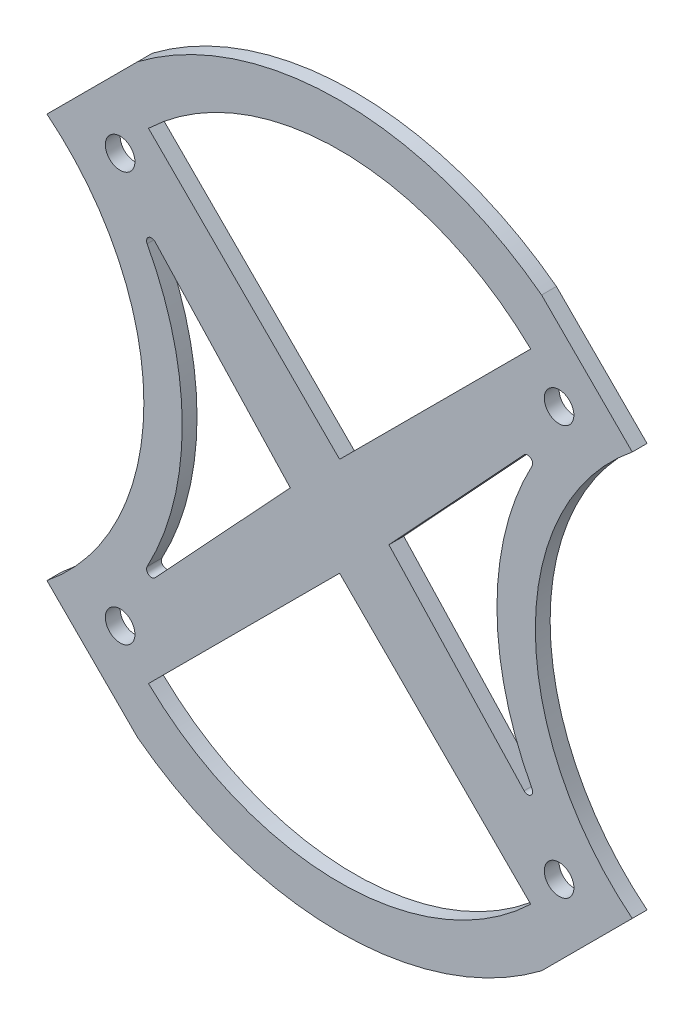
ISO-10303-21;
HEADER;
FILE_DESCRIPTION(('STEP AP214'),'2;1');
FILE_NAME('part.step','',(''),(''),'','','');
FILE_SCHEMA(('AUTOMOTIVE_DESIGN { 1 0 10303 214 1 1 1 1 }'));
ENDSEC;
DATA;
#1=APPLICATION_CONTEXT('core data for automotive mechanical design processes');
#2=APPLICATION_PROTOCOL_DEFINITION('international standard','automotive_design',2000,#1);
#3=PRODUCT_CONTEXT('',#1,'mechanical');
#4=PRODUCT('Part','Part','',(#3));
#5=PRODUCT_RELATED_PRODUCT_CATEGORY('part','',(#4));
#6=PRODUCT_DEFINITION_FORMATION('','',#4);
#7=PRODUCT_DEFINITION_CONTEXT('part definition',#1,'design');
#8=PRODUCT_DEFINITION('design','',#6,#7);
#9=PRODUCT_DEFINITION_SHAPE('','',#8);
#10=(LENGTH_UNIT() NAMED_UNIT(*) SI_UNIT(.MILLI.,.METRE.));
#11=(NAMED_UNIT(*) PLANE_ANGLE_UNIT() SI_UNIT($,.RADIAN.));
#12=(NAMED_UNIT(*) SI_UNIT($,.STERADIAN.) SOLID_ANGLE_UNIT());
#13=UNCERTAINTY_MEASURE_WITH_UNIT(LENGTH_MEASURE(1.E-05),#10,'distance_accuracy_value','');
#14=(GEOMETRIC_REPRESENTATION_CONTEXT(3) GLOBAL_UNCERTAINTY_ASSIGNED_CONTEXT((#13)) GLOBAL_UNIT_ASSIGNED_CONTEXT((#10,
#11,#12)) REPRESENTATION_CONTEXT('',''));
#15=CARTESIAN_POINT('',(0.,0.,0.));
#16=DIRECTION('',(0.,0.,1.));
#17=DIRECTION('',(1.,0.,0.));
#18=AXIS2_PLACEMENT_3D('',#15,#16,#17);
#19=CARTESIAN_POINT('',(-92.1866433585992,0.,3.));
#20=DIRECTION('',(0.,0.,-1.));
#21=DIRECTION('',(-1.,0.,0.));
#22=AXIS2_PLACEMENT_3D('',#19,#20,#21);
#23=PLANE('',#22);
#24=CARTESIAN_POINT('',(-44.5,41.5,3.));
#25=DIRECTION('',(0.,0.,1.));
#26=DIRECTION('',(1.,0.,0.));
#27=AXIS2_PLACEMENT_3D('',#24,#25,#26);
#28=CIRCLE('',#27,3.);
#29=CARTESIAN_POINT('',(-41.5,41.5,3.));
#30=VERTEX_POINT('',#29);
#31=EDGE_CURVE('E656',#30,#30,#28,.T.);
#32=ORIENTED_EDGE('',*,*,#31,.F.);
#33=EDGE_LOOP('',(#32));
#34=FACE_BOUND('',#33,.T.);
#35=CARTESIAN_POINT('',(44.5,41.5,3.));
#36=DIRECTION('',(0.,0.,1.));
#37=DIRECTION('',(1.,0.,0.));
#38=AXIS2_PLACEMENT_3D('',#35,#36,#37);
#39=CIRCLE('',#38,3.);
#40=CARTESIAN_POINT('',(47.5,41.5,3.));
#41=VERTEX_POINT('',#40);
#42=EDGE_CURVE('E660',#41,#41,#39,.T.);
#43=ORIENTED_EDGE('',*,*,#42,.F.);
#44=EDGE_LOOP('',(#43));
#45=FACE_BOUND('',#44,.T.);
#46=CARTESIAN_POINT('',(44.5,-41.5,3.));
#47=DIRECTION('',(0.,0.,1.));
#48=DIRECTION('',(1.,0.,0.));
#49=AXIS2_PLACEMENT_3D('',#46,#47,#48);
#50=CIRCLE('',#49,3.);
#51=CARTESIAN_POINT('',(47.5,-41.5,3.));
#52=VERTEX_POINT('',#51);
#53=EDGE_CURVE('E668',#52,#52,#50,.T.);
#54=ORIENTED_EDGE('',*,*,#53,.F.);
#55=EDGE_LOOP('',(#54));
#56=FACE_BOUND('',#55,.T.);
#57=CARTESIAN_POINT('',(-44.5,-41.5,3.));
#58=DIRECTION('',(0.,0.,1.));
#59=DIRECTION('',(1.,0.,0.));
#60=AXIS2_PLACEMENT_3D('',#57,#58,#59);
#61=CIRCLE('',#60,3.);
#62=CARTESIAN_POINT('',(-41.5,-41.5,3.));
#63=VERTEX_POINT('',#62);
#64=EDGE_CURVE('E666',#63,#63,#61,.T.);
#65=ORIENTED_EDGE('',*,*,#64,.F.);
#66=EDGE_LOOP('',(#65));
#67=FACE_BOUND('',#66,.T.);
#68=DIRECTION('',(0.680734224272991,0.732530488036812,0.));
#69=VECTOR('',#68,1.);
#70=CARTESIAN_POINT('',(-10.,0.,3.));
#71=LINE('',#70,#69);
#72=CARTESIAN_POINT('',(-37.4101351012741,-29.4957399333564,3.));
#73=VERTEX_POINT('',#72);
#74=CARTESIAN_POINT('',(-10.,0.,3.));
#75=VERTEX_POINT('',#74);
#76=EDGE_CURVE('E250',#73,#75,#71,.T.);
#77=ORIENTED_EDGE('',*,*,#76,.F.);
#78=CARTESIAN_POINT('',(-38.1426655893109,-28.8150057090834,3.));
#79=DIRECTION('',(0.,0.,1.));
#80=DIRECTION('',(-1.,0.,0.));
#81=AXIS2_PLACEMENT_3D('',#78,#79,#80);
#82=CIRCLE('',#81,1.00000000000001);
#83=CARTESIAN_POINT('',(-39.0240621147107,-28.3426285663116,3.));
#84=VERTEX_POINT('',#83);
#85=EDGE_CURVE('E260',#84,#73,#82,.T.);
#86=ORIENTED_EDGE('',*,*,#85,.F.);
#87=CARTESIAN_POINT('',(-91.9078536386937,0.,3.));
#88=DIRECTION('',(0.,0.,-1.));
#89=DIRECTION('',(-1.,0.,0.));
#90=AXIS2_PLACEMENT_3D('',#87,#88,#89);
#91=CIRCLE('',#90,60.);
#92=CARTESIAN_POINT('',(-39.0240621147107,28.3426285663116,3.));
#93=VERTEX_POINT('',#92);
#94=EDGE_CURVE('E257',#93,#84,#91,.T.);
#95=ORIENTED_EDGE('',*,*,#94,.F.);
#96=CARTESIAN_POINT('',(-38.1426655893109,28.8150057090834,3.));
#97=DIRECTION('',(0.,0.,1.));
#98=DIRECTION('',(-1.,0.,0.));
#99=AXIS2_PLACEMENT_3D('',#96,#97,#98);
#100=CIRCLE('',#99,1.);
#101=CARTESIAN_POINT('',(-37.4101351012741,29.4957399333564,3.));
#102=VERTEX_POINT('',#101);
#103=EDGE_CURVE('E255',#102,#93,#100,.T.);
#104=ORIENTED_EDGE('',*,*,#103,.F.);
#105=DIRECTION('',(-0.680734224272991,0.732530488036811,0.));
#106=VECTOR('',#105,1.);
#107=CARTESIAN_POINT('',(-37.4101351012741,29.4957399333564,3.));
#108=LINE('',#107,#106);
#109=EDGE_CURVE('E252',#75,#102,#108,.T.);
#110=ORIENTED_EDGE('',*,*,#109,.F.);
#111=EDGE_LOOP('',(#77,#86,#95,#104,#110));
#112=FACE_BOUND('',#111,.T.);
#113=CARTESIAN_POINT('',(0.,8.32343771846981,3.));
#114=DIRECTION('',(0.,0.,1.));
#115=DIRECTION('',(-1.,0.,0.));
#116=AXIS2_PLACEMENT_3D('',#113,#114,#115);
#117=CIRCLE('',#116,56.);
#118=CARTESIAN_POINT('',(38.7508244910755,48.7508244910756,3.));
#119=VERTEX_POINT('',#118);
#120=CARTESIAN_POINT('',(-38.7508244910755,48.7508244910756,3.));
#121=VERTEX_POINT('',#120);
#122=EDGE_CURVE('E312',#119,#121,#117,.T.);
#123=ORIENTED_EDGE('',*,*,#122,.F.);
#124=DIRECTION('',(0.707106781186546,0.707106781186549,0.));
#125=VECTOR('',#124,1.);
#126=CARTESIAN_POINT('',(0.,10.,3.));
#127=LINE('',#126,#125);
#128=CARTESIAN_POINT('',(0.,10.,3.));
#129=VERTEX_POINT('',#128);
#130=EDGE_CURVE('E318',#129,#119,#127,.T.);
#131=ORIENTED_EDGE('',*,*,#130,.F.);
#132=DIRECTION('',(0.707106781186546,-0.707106781186549,0.));
#133=VECTOR('',#132,1.);
#134=CARTESIAN_POINT('',(-38.7508244910755,48.7508244910756,3.));
#135=LINE('',#134,#133);
#136=EDGE_CURVE('E314',#121,#129,#135,.T.);
#137=ORIENTED_EDGE('',*,*,#136,.F.);
#138=EDGE_LOOP('',(#123,#131,#137));
#139=FACE_BOUND('',#138,.T.);
#140=CARTESIAN_POINT('',(-92.1866433585992,0.,3.));
#141=DIRECTION('',(0.,0.,-1.));
#142=DIRECTION('',(-1.,0.,0.));
#143=AXIS2_PLACEMENT_3D('',#140,#141,#142);
#144=CIRCLE('',#143,52.5);
#145=CARTESIAN_POINT('',(-59.3410896032044,40.9563132923542,3.));
#146=VERTEX_POINT('',#145);
#147=CARTESIAN_POINT('',(-59.3410896032044,-40.9563132923542,3.));
#148=VERTEX_POINT('',#147);
#149=EDGE_CURVE('E336',#146,#148,#144,.T.);
#150=ORIENTED_EDGE('',*,*,#149,.T.);
#151=DIRECTION('',(0.707106781186547,-0.707106781186547,0.));
#152=VECTOR('',#151,1.);
#153=CARTESIAN_POINT('',(-59.3410896032044,-40.9563132923542,3.));
#154=LINE('',#153,#152);
#155=CARTESIAN_POINT('',(-40.9563132923542,-59.3410896032044,3.));
#156=VERTEX_POINT('',#155);
#157=EDGE_CURVE('E339',#148,#156,#154,.T.);
#158=ORIENTED_EDGE('',*,*,#157,.T.);
#159=CARTESIAN_POINT('',(0.,-5.05867623111361,3.));
#160=DIRECTION('',(0.,0.,1.));
#161=DIRECTION('',(1.,0.,0.));
#162=AXIS2_PLACEMENT_3D('',#159,#160,#161);
#163=CIRCLE('',#162,68.);
#164=CARTESIAN_POINT('',(40.9563132923542,-59.3410896032043,3.));
#165=VERTEX_POINT('',#164);
#166=EDGE_CURVE('E342',#156,#165,#163,.T.);
#167=ORIENTED_EDGE('',*,*,#166,.T.);
#168=DIRECTION('',(0.707106781186548,0.707106781186547,0.));
#169=VECTOR('',#168,1.);
#170=CARTESIAN_POINT('',(40.9563132923542,-59.3410896032043,3.));
#171=LINE('',#170,#169);
#172=CARTESIAN_POINT('',(59.3410896032044,-40.9563132923541,3.));
#173=VERTEX_POINT('',#172);
#174=EDGE_CURVE('E344',#165,#173,#171,.T.);
#175=ORIENTED_EDGE('',*,*,#174,.T.);
#176=CARTESIAN_POINT('',(92.1866433585992,0.,3.));
#177=DIRECTION('',(0.,0.,-1.));
#178=DIRECTION('',(1.,0.,0.));
#179=AXIS2_PLACEMENT_3D('',#176,#177,#178);
#180=CIRCLE('',#179,52.5);
#181=CARTESIAN_POINT('',(59.3410896032044,40.9563132923541,3.));
#182=VERTEX_POINT('',#181);
#183=EDGE_CURVE('E346',#173,#182,#180,.T.);
#184=ORIENTED_EDGE('',*,*,#183,.T.);
#185=DIRECTION('',(-0.707106781186548,0.707106781186547,0.));
#186=VECTOR('',#185,1.);
#187=CARTESIAN_POINT('',(40.9563132923542,59.3410896032043,3.));
#188=LINE('',#187,#186);
#189=CARTESIAN_POINT('',(40.9563132923542,59.3410896032043,3.));
#190=VERTEX_POINT('',#189);
#191=EDGE_CURVE('E348',#182,#190,#188,.T.);
#192=ORIENTED_EDGE('',*,*,#191,.T.);
#193=CARTESIAN_POINT('',(0.,5.05867623111361,3.));
#194=DIRECTION('',(0.,0.,1.));
#195=DIRECTION('',(-1.,0.,0.));
#196=AXIS2_PLACEMENT_3D('',#193,#194,#195);
#197=CIRCLE('',#196,68.);
#198=CARTESIAN_POINT('',(-40.9563132923542,59.3410896032044,3.));
#199=VERTEX_POINT('',#198);
#200=EDGE_CURVE('E350',#190,#199,#197,.T.);
#201=ORIENTED_EDGE('',*,*,#200,.T.);
#202=DIRECTION('',(-0.707106781186547,-0.707106781186547,0.));
#203=VECTOR('',#202,1.);
#204=CARTESIAN_POINT('',(-59.3410896032044,40.9563132923542,3.));
#205=LINE('',#204,#203);
#206=EDGE_CURVE('E352',#199,#146,#205,.T.);
#207=ORIENTED_EDGE('',*,*,#206,.T.);
#208=EDGE_LOOP('',(#150,#158,#167,#175,#184,#192,#201,#207));
#209=FACE_BOUND('',#208,.T.);
#210=CARTESIAN_POINT('',(0.,-8.32343771846981,3.));
#211=DIRECTION('',(0.,0.,1.));
#212=DIRECTION('',(1.,0.,0.));
#213=AXIS2_PLACEMENT_3D('',#210,#211,#212);
#214=CIRCLE('',#213,56.);
#215=CARTESIAN_POINT('',(-38.7508244910755,-48.7508244910756,3.));
#216=VERTEX_POINT('',#215);
#217=CARTESIAN_POINT('',(38.7508244910755,-48.7508244910756,3.));
#218=VERTEX_POINT('',#217);
#219=EDGE_CURVE('E288',#216,#218,#214,.T.);
#220=ORIENTED_EDGE('',*,*,#219,.F.);
#221=DIRECTION('',(-0.707106781186546,-0.707106781186549,0.));
#222=VECTOR('',#221,1.);
#223=CARTESIAN_POINT('',(-38.7508244910755,-48.7508244910756,3.));
#224=LINE('',#223,#222);
#225=CARTESIAN_POINT('',(0.,-10.,3.));
#226=VERTEX_POINT('',#225);
#227=EDGE_CURVE('E294',#226,#216,#224,.T.);
#228=ORIENTED_EDGE('',*,*,#227,.F.);
#229=DIRECTION('',(-0.707106781186546,0.707106781186549,0.));
#230=VECTOR('',#229,1.);
#231=CARTESIAN_POINT('',(0.,-10.,3.));
#232=LINE('',#231,#230);
#233=EDGE_CURVE('E290',#218,#226,#232,.T.);
#234=ORIENTED_EDGE('',*,*,#233,.F.);
#235=EDGE_LOOP('',(#220,#228,#234));
#236=FACE_BOUND('',#235,.T.);
#237=DIRECTION('',(-0.680734224272991,-0.732530488036811,0.));
#238=VECTOR('',#237,1.);
#239=CARTESIAN_POINT('',(37.4101351012741,29.4957399333564,3.));
#240=LINE('',#239,#238);
#241=CARTESIAN_POINT('',(37.4101351012741,29.4957399333564,3.));
#242=VERTEX_POINT('',#241);
#243=CARTESIAN_POINT('',(10.,0.,3.));
#244=VERTEX_POINT('',#243);
#245=EDGE_CURVE('E204',#242,#244,#240,.T.);
#246=ORIENTED_EDGE('',*,*,#245,.F.);
#247=CARTESIAN_POINT('',(38.1426655893109,28.8150057090834,3.));
#248=DIRECTION('',(0.,0.,1.));
#249=DIRECTION('',(1.,0.,0.));
#250=AXIS2_PLACEMENT_3D('',#247,#248,#249);
#251=CIRCLE('',#250,1.);
#252=CARTESIAN_POINT('',(39.0240621147107,28.3426285663116,3.));
#253=VERTEX_POINT('',#252);
#254=EDGE_CURVE('E232',#253,#242,#251,.T.);
#255=ORIENTED_EDGE('',*,*,#254,.F.);
#256=CARTESIAN_POINT('',(91.9078536386937,0.,3.));
#257=DIRECTION('',(0.,0.,-1.));
#258=DIRECTION('',(1.,0.,0.));
#259=AXIS2_PLACEMENT_3D('',#256,#257,#258);
#260=CIRCLE('',#259,60.);
#261=CARTESIAN_POINT('',(39.0240621147107,-28.3426285663116,3.));
#262=VERTEX_POINT('',#261);
#263=EDGE_CURVE('E227',#262,#253,#260,.T.);
#264=ORIENTED_EDGE('',*,*,#263,.F.);
#265=CARTESIAN_POINT('',(38.1426655893109,-28.8150057090834,3.));
#266=DIRECTION('',(0.,0.,1.));
#267=DIRECTION('',(1.,0.,0.));
#268=AXIS2_PLACEMENT_3D('',#265,#266,#267);
#269=CIRCLE('',#268,1.00000000000001);
#270=CARTESIAN_POINT('',(37.4101351012741,-29.4957399333564,3.));
#271=VERTEX_POINT('',#270);
#272=EDGE_CURVE('E225',#271,#262,#269,.T.);
#273=ORIENTED_EDGE('',*,*,#272,.F.);
#274=DIRECTION('',(0.680734224272991,-0.732530488036812,0.));
#275=VECTOR('',#274,1.);
#276=CARTESIAN_POINT('',(10.,0.,3.));
#277=LINE('',#276,#275);
#278=EDGE_CURVE('E212',#244,#271,#277,.T.);
#279=ORIENTED_EDGE('',*,*,#278,.F.);
#280=EDGE_LOOP('',(#246,#255,#264,#273,#279));
#281=FACE_BOUND('',#280,.T.);
#282=ADVANCED_FACE('F43',(#34,#45,#56,#67,#112,#139,#209,#236,#281),#23,.F.);
#283=CARTESIAN_POINT('',(-92.1866433585992,0.,3.));
#284=DIRECTION('',(0.,0.,-1.));
#285=DIRECTION('',(-1.,0.,0.));
#286=AXIS2_PLACEMENT_3D('',#283,#284,#285);
#287=CYLINDRICAL_SURFACE('',#286,52.5);
#288=CARTESIAN_POINT('',(-92.1866433585992,0.,0.));
#289=DIRECTION('',(0.,0.,-1.));
#290=DIRECTION('',(-1.,0.,0.));
#291=AXIS2_PLACEMENT_3D('',#288,#289,#290);
#292=CIRCLE('',#291,52.5);
#293=CARTESIAN_POINT('',(-59.3410896032044,40.9563132923542,0.));
#294=VERTEX_POINT('',#293);
#295=CARTESIAN_POINT('',(-59.3410896032044,-40.9563132923542,0.));
#296=VERTEX_POINT('',#295);
#297=EDGE_CURVE('E335',#294,#296,#292,.T.);
#298=ORIENTED_EDGE('',*,*,#297,.T.);
#299=DIRECTION('',(0.,0.,-1.));
#300=VECTOR('',#299,1.);
#301=CARTESIAN_POINT('',(-59.3410896032044,-40.9563132923542,3.));
#302=LINE('',#301,#300);
#303=EDGE_CURVE('E11',#148,#296,#302,.T.);
#304=ORIENTED_EDGE('',*,*,#303,.F.);
#305=ORIENTED_EDGE('',*,*,#149,.F.);
#306=DIRECTION('',(0.,0.,-1.));
#307=VECTOR('',#306,1.);
#308=CARTESIAN_POINT('',(-59.3410896032044,40.9563132923542,3.));
#309=LINE('',#308,#307);
#310=EDGE_CURVE('E354',#146,#294,#309,.T.);
#311=ORIENTED_EDGE('',*,*,#310,.T.);
#312=EDGE_LOOP('',(#298,#304,#305,#311));
#313=FACE_BOUND('',#312,.T.);
#314=ADVANCED_FACE('F416',(#313),#287,.F.);
#315=CARTESIAN_POINT('',(-59.3410896032044,-40.9563132923542,3.));
#316=DIRECTION('',(0.707106781186548,0.707106781186548,0.));
#317=DIRECTION('',(-0.707106781186548,0.707106781186548,0.));
#318=AXIS2_PLACEMENT_3D('',#315,#316,#317);
#319=PLANE('',#318);
#320=DIRECTION('',(0.707106781186547,-0.707106781186547,0.));
#321=VECTOR('',#320,1.);
#322=CARTESIAN_POINT('',(-59.3410896032044,-40.9563132923542,0.));
#323=LINE('',#322,#321);
#324=CARTESIAN_POINT('',(-40.9563132923542,-59.3410896032044,0.));
#325=VERTEX_POINT('',#324);
#326=EDGE_CURVE('E357',#296,#325,#323,.T.);
#327=ORIENTED_EDGE('',*,*,#326,.T.);
#328=DIRECTION('',(0.,0.,-1.));
#329=VECTOR('',#328,1.);
#330=CARTESIAN_POINT('',(-40.9563132923542,-59.3410896032044,3.));
#331=LINE('',#330,#329);
#332=EDGE_CURVE('E51',#156,#325,#331,.T.);
#333=ORIENTED_EDGE('',*,*,#332,.F.);
#334=ORIENTED_EDGE('',*,*,#157,.F.);
#335=ORIENTED_EDGE('',*,*,#303,.T.);
#336=EDGE_LOOP('',(#327,#333,#334,#335));
#337=FACE_BOUND('',#336,.T.);
#338=ADVANCED_FACE('F414',(#337),#319,.F.);
#339=CARTESIAN_POINT('',(0.,-5.05867623111361,3.));
#340=DIRECTION('',(0.,0.,-1.));
#341=DIRECTION('',(-1.,0.,0.));
#342=AXIS2_PLACEMENT_3D('',#339,#340,#341);
#343=CYLINDRICAL_SURFACE('',#342,68.);
#344=CARTESIAN_POINT('',(0.,-5.05867623111361,0.));
#345=DIRECTION('',(0.,0.,1.));
#346=DIRECTION('',(1.,0.,0.));
#347=AXIS2_PLACEMENT_3D('',#344,#345,#346);
#348=CIRCLE('',#347,68.);
#349=CARTESIAN_POINT('',(40.9563132923542,-59.3410896032043,0.));
#350=VERTEX_POINT('',#349);
#351=EDGE_CURVE('E359',#325,#350,#348,.T.);
#352=ORIENTED_EDGE('',*,*,#351,.T.);
#353=DIRECTION('',(0.,0.,-1.));
#354=VECTOR('',#353,1.);
#355=CARTESIAN_POINT('',(40.9563132923542,-59.3410896032043,3.));
#356=LINE('',#355,#354);
#357=EDGE_CURVE('E384',#165,#350,#356,.T.);
#358=ORIENTED_EDGE('',*,*,#357,.F.);
#359=ORIENTED_EDGE('',*,*,#166,.F.);
#360=ORIENTED_EDGE('',*,*,#332,.T.);
#361=EDGE_LOOP('',(#352,#358,#359,#360));
#362=FACE_BOUND('',#361,.T.);
#363=ADVANCED_FACE('F391',(#362),#343,.T.);
#364=CARTESIAN_POINT('',(40.9563132923542,-59.3410896032043,3.));
#365=DIRECTION('',(-0.707106781186547,0.707106781186548,0.));
#366=DIRECTION('',(-0.707106781186548,-0.707106781186547,0.));
#367=AXIS2_PLACEMENT_3D('',#364,#365,#366);
#368=PLANE('',#367);
#369=DIRECTION('',(0.707106781186548,0.707106781186547,0.));
#370=VECTOR('',#369,1.);
#371=CARTESIAN_POINT('',(40.9563132923542,-59.3410896032043,0.));
#372=LINE('',#371,#370);
#373=CARTESIAN_POINT('',(59.3410896032044,-40.9563132923541,0.));
#374=VERTEX_POINT('',#373);
#375=EDGE_CURVE('E361',#350,#374,#372,.T.);
#376=ORIENTED_EDGE('',*,*,#375,.T.);
#377=DIRECTION('',(0.,0.,-1.));
#378=VECTOR('',#377,1.);
#379=CARTESIAN_POINT('',(59.3410896032044,-40.9563132923541,3.));
#380=LINE('',#379,#378);
#381=EDGE_CURVE('E381',#173,#374,#380,.T.);
#382=ORIENTED_EDGE('',*,*,#381,.F.);
#383=ORIENTED_EDGE('',*,*,#174,.F.);
#384=ORIENTED_EDGE('',*,*,#357,.T.);
#385=EDGE_LOOP('',(#376,#382,#383,#384));
#386=FACE_BOUND('',#385,.T.);
#387=ADVANCED_FACE('F402',(#386),#368,.F.);
#388=CARTESIAN_POINT('',(92.1866433585992,0.,3.));
#389=DIRECTION('',(0.,0.,-1.));
#390=DIRECTION('',(-1.,0.,0.));
#391=AXIS2_PLACEMENT_3D('',#388,#389,#390);
#392=CYLINDRICAL_SURFACE('',#391,52.5);
#393=CARTESIAN_POINT('',(92.1866433585992,0.,0.));
#394=DIRECTION('',(0.,0.,-1.));
#395=DIRECTION('',(1.,0.,0.));
#396=AXIS2_PLACEMENT_3D('',#393,#394,#395);
#397=CIRCLE('',#396,52.5);
#398=CARTESIAN_POINT('',(59.3410896032044,40.9563132923541,0.));
#399=VERTEX_POINT('',#398);
#400=EDGE_CURVE('E363',#374,#399,#397,.T.);
#401=ORIENTED_EDGE('',*,*,#400,.T.);
#402=DIRECTION('',(0.,0.,-1.));
#403=VECTOR('',#402,1.);
#404=CARTESIAN_POINT('',(59.3410896032044,40.9563132923541,3.));
#405=LINE('',#404,#403);
#406=EDGE_CURVE('E378',#182,#399,#405,.T.);
#407=ORIENTED_EDGE('',*,*,#406,.F.);
#408=ORIENTED_EDGE('',*,*,#183,.F.);
#409=ORIENTED_EDGE('',*,*,#381,.T.);
#410=EDGE_LOOP('',(#401,#407,#408,#409));
#411=FACE_BOUND('',#410,.T.);
#412=ADVANCED_FACE('F406',(#411),#392,.F.);
#413=CARTESIAN_POINT('',(40.9563132923542,59.3410896032043,3.));
#414=DIRECTION('',(-0.707106781186547,-0.707106781186548,0.));
#415=DIRECTION('',(0.707106781186548,-0.707106781186547,0.));
#416=AXIS2_PLACEMENT_3D('',#413,#414,#415);
#417=PLANE('',#416);
#418=DIRECTION('',(-0.707106781186548,0.707106781186547,0.));
#419=VECTOR('',#418,1.);
#420=CARTESIAN_POINT('',(40.9563132923542,59.3410896032043,0.));
#421=LINE('',#420,#419);
#422=CARTESIAN_POINT('',(40.9563132923542,59.3410896032043,0.));
#423=VERTEX_POINT('',#422);
#424=EDGE_CURVE('E365',#399,#423,#421,.T.);
#425=ORIENTED_EDGE('',*,*,#424,.T.);
#426=DIRECTION('',(0.,0.,-1.));
#427=VECTOR('',#426,1.);
#428=CARTESIAN_POINT('',(40.9563132923542,59.3410896032043,3.));
#429=LINE('',#428,#427);
#430=EDGE_CURVE('E375',#190,#423,#429,.T.);
#431=ORIENTED_EDGE('',*,*,#430,.F.);
#432=ORIENTED_EDGE('',*,*,#191,.F.);
#433=ORIENTED_EDGE('',*,*,#406,.T.);
#434=EDGE_LOOP('',(#425,#431,#432,#433));
#435=FACE_BOUND('',#434,.T.);
#436=ADVANCED_FACE('F428',(#435),#417,.F.);
#437=CARTESIAN_POINT('',(0.,5.05867623111361,3.));
#438=DIRECTION('',(0.,0.,-1.));
#439=DIRECTION('',(-1.,0.,0.));
#440=AXIS2_PLACEMENT_3D('',#437,#438,#439);
#441=CYLINDRICAL_SURFACE('',#440,68.);
#442=CARTESIAN_POINT('',(0.,5.05867623111361,0.));
#443=DIRECTION('',(0.,0.,1.));
#444=DIRECTION('',(-1.,0.,0.));
#445=AXIS2_PLACEMENT_3D('',#442,#443,#444);
#446=CIRCLE('',#445,68.);
#447=CARTESIAN_POINT('',(-40.9563132923542,59.3410896032044,0.));
#448=VERTEX_POINT('',#447);
#449=EDGE_CURVE('E367',#423,#448,#446,.T.);
#450=ORIENTED_EDGE('',*,*,#449,.T.);
#451=DIRECTION('',(0.,0.,-1.));
#452=VECTOR('',#451,1.);
#453=CARTESIAN_POINT('',(-40.9563132923542,59.3410896032044,3.));
#454=LINE('',#453,#452);
#455=EDGE_CURVE('E372',#199,#448,#454,.T.);
#456=ORIENTED_EDGE('',*,*,#455,.F.);
#457=ORIENTED_EDGE('',*,*,#200,.F.);
#458=ORIENTED_EDGE('',*,*,#430,.T.);
#459=EDGE_LOOP('',(#450,#456,#457,#458));
#460=FACE_BOUND('',#459,.T.);
#461=ADVANCED_FACE('F426',(#460),#441,.T.);
#462=CARTESIAN_POINT('',(-59.3410896032044,40.9563132923542,3.));
#463=DIRECTION('',(0.707106781186548,-0.707106781186548,0.));
#464=DIRECTION('',(0.707106781186548,0.707106781186548,0.));
#465=AXIS2_PLACEMENT_3D('',#462,#463,#464);
#466=PLANE('',#465);
#467=DIRECTION('',(-0.707106781186547,-0.707106781186547,0.));
#468=VECTOR('',#467,1.);
#469=CARTESIAN_POINT('',(-59.3410896032044,40.9563132923542,0.));
#470=LINE('',#469,#468);
#471=EDGE_CURVE('E340',#448,#294,#470,.T.);
#472=ORIENTED_EDGE('',*,*,#471,.T.);
#473=ORIENTED_EDGE('',*,*,#310,.F.);
#474=ORIENTED_EDGE('',*,*,#206,.F.);
#475=ORIENTED_EDGE('',*,*,#455,.T.);
#476=EDGE_LOOP('',(#472,#473,#474,#475));
#477=FACE_BOUND('',#476,.T.);
#478=ADVANCED_FACE('F421',(#477),#466,.F.);
#479=CARTESIAN_POINT('',(0.,8.32343771846981,3.));
#480=DIRECTION('',(0.,0.,-1.));
#481=DIRECTION('',(-1.,0.,0.));
#482=AXIS2_PLACEMENT_3D('',#479,#480,#481);
#483=CYLINDRICAL_SURFACE('',#482,56.);
#484=CARTESIAN_POINT('',(0.,8.32343771846981,0.));
#485=DIRECTION('',(0.,0.,1.));
#486=DIRECTION('',(-1.,0.,0.));
#487=AXIS2_PLACEMENT_3D('',#484,#485,#486);
#488=CIRCLE('',#487,56.);
#489=CARTESIAN_POINT('',(38.7508244910755,48.7508244910756,0.));
#490=VERTEX_POINT('',#489);
#491=CARTESIAN_POINT('',(-38.7508244910755,48.7508244910756,0.));
#492=VERTEX_POINT('',#491);
#493=EDGE_CURVE('E311',#490,#492,#488,.T.);
#494=ORIENTED_EDGE('',*,*,#493,.F.);
#495=DIRECTION('',(0.,0.,-1.));
#496=VECTOR('',#495,1.);
#497=CARTESIAN_POINT('',(38.7508244910755,48.7508244910756,3.));
#498=LINE('',#497,#496);
#499=EDGE_CURVE('E320',#119,#490,#498,.T.);
#500=ORIENTED_EDGE('',*,*,#499,.F.);
#501=ORIENTED_EDGE('',*,*,#122,.T.);
#502=DIRECTION('',(0.,0.,-1.));
#503=VECTOR('',#502,1.);
#504=CARTESIAN_POINT('',(-38.7508244910755,48.7508244910756,3.));
#505=LINE('',#504,#503);
#506=EDGE_CURVE('E332',#121,#492,#505,.T.);
#507=ORIENTED_EDGE('',*,*,#506,.T.);
#508=EDGE_LOOP('',(#494,#500,#501,#507));
#509=FACE_BOUND('',#508,.T.);
#510=ADVANCED_FACE('F449',(#509),#483,.F.);
#511=CARTESIAN_POINT('',(-38.7508244910755,48.7508244910756,3.));
#512=DIRECTION('',(0.707106781186549,0.707106781186546,0.));
#513=DIRECTION('',(-0.707106781186546,0.707106781186549,0.));
#514=AXIS2_PLACEMENT_3D('',#511,#512,#513);
#515=PLANE('',#514);
#516=DIRECTION('',(0.707106781186546,-0.707106781186549,0.));
#517=VECTOR('',#516,1.);
#518=CARTESIAN_POINT('',(-38.7508244910755,48.7508244910756,0.));
#519=LINE('',#518,#517);
#520=CARTESIAN_POINT('',(0.,10.,0.));
#521=VERTEX_POINT('',#520);
#522=EDGE_CURVE('E323',#492,#521,#519,.T.);
#523=ORIENTED_EDGE('',*,*,#522,.F.);
#524=ORIENTED_EDGE('',*,*,#506,.F.);
#525=ORIENTED_EDGE('',*,*,#136,.T.);
#526=DIRECTION('',(0.,0.,-1.));
#527=VECTOR('',#526,1.);
#528=CARTESIAN_POINT('',(0.,10.,3.));
#529=LINE('',#528,#527);
#530=EDGE_CURVE('E330',#129,#521,#529,.T.);
#531=ORIENTED_EDGE('',*,*,#530,.T.);
#532=EDGE_LOOP('',(#523,#524,#525,#531));
#533=FACE_BOUND('',#532,.T.);
#534=ADVANCED_FACE('F455',(#533),#515,.T.);
#535=CARTESIAN_POINT('',(0.,10.,3.));
#536=DIRECTION('',(-0.707106781186549,0.707106781186546,0.));
#537=DIRECTION('',(-0.707106781186546,-0.707106781186549,0.));
#538=AXIS2_PLACEMENT_3D('',#535,#536,#537);
#539=PLANE('',#538);
#540=DIRECTION('',(0.707106781186546,0.707106781186549,0.));
#541=VECTOR('',#540,1.);
#542=CARTESIAN_POINT('',(0.,10.,0.));
#543=LINE('',#542,#541);
#544=EDGE_CURVE('E315',#521,#490,#543,.T.);
#545=ORIENTED_EDGE('',*,*,#544,.F.);
#546=ORIENTED_EDGE('',*,*,#530,.F.);
#547=ORIENTED_EDGE('',*,*,#130,.T.);
#548=ORIENTED_EDGE('',*,*,#499,.T.);
#549=EDGE_LOOP('',(#545,#546,#547,#548));
#550=FACE_BOUND('',#549,.T.);
#551=ADVANCED_FACE('F460',(#550),#539,.T.);
#552=CARTESIAN_POINT('',(0.,-8.32343771846981,3.));
#553=DIRECTION('',(0.,0.,-1.));
#554=DIRECTION('',(-1.,0.,0.));
#555=AXIS2_PLACEMENT_3D('',#552,#553,#554);
#556=CYLINDRICAL_SURFACE('',#555,56.);
#557=CARTESIAN_POINT('',(0.,-8.32343771846981,0.));
#558=DIRECTION('',(0.,0.,1.));
#559=DIRECTION('',(1.,0.,0.));
#560=AXIS2_PLACEMENT_3D('',#557,#558,#559);
#561=CIRCLE('',#560,56.);
#562=CARTESIAN_POINT('',(-38.7508244910755,-48.7508244910756,0.));
#563=VERTEX_POINT('',#562);
#564=CARTESIAN_POINT('',(38.7508244910755,-48.7508244910756,0.));
#565=VERTEX_POINT('',#564);
#566=EDGE_CURVE('E287',#563,#565,#561,.T.);
#567=ORIENTED_EDGE('',*,*,#566,.F.);
#568=DIRECTION('',(0.,0.,-1.));
#569=VECTOR('',#568,1.);
#570=CARTESIAN_POINT('',(-38.7508244910755,-48.7508244910756,3.));
#571=LINE('',#570,#569);
#572=EDGE_CURVE('E296',#216,#563,#571,.T.);
#573=ORIENTED_EDGE('',*,*,#572,.F.);
#574=ORIENTED_EDGE('',*,*,#219,.T.);
#575=DIRECTION('',(0.,0.,-1.));
#576=VECTOR('',#575,1.);
#577=CARTESIAN_POINT('',(38.7508244910755,-48.7508244910756,3.));
#578=LINE('',#577,#576);
#579=EDGE_CURVE('E308',#218,#565,#578,.T.);
#580=ORIENTED_EDGE('',*,*,#579,.T.);
#581=EDGE_LOOP('',(#567,#573,#574,#580));
#582=FACE_BOUND('',#581,.T.);
#583=ADVANCED_FACE('F524',(#582),#556,.F.);
#584=CARTESIAN_POINT('',(0.,-10.,3.));
#585=DIRECTION('',(-0.707106781186549,-0.707106781186546,0.));
#586=DIRECTION('',(0.707106781186546,-0.707106781186549,0.));
#587=AXIS2_PLACEMENT_3D('',#584,#585,#586);
#588=PLANE('',#587);
#589=DIRECTION('',(-0.707106781186546,0.707106781186549,0.));
#590=VECTOR('',#589,1.);
#591=CARTESIAN_POINT('',(0.,-10.,0.));
#592=LINE('',#591,#590);
#593=CARTESIAN_POINT('',(0.,-10.,0.));
#594=VERTEX_POINT('',#593);
#595=EDGE_CURVE('E299',#565,#594,#592,.T.);
#596=ORIENTED_EDGE('',*,*,#595,.F.);
#597=ORIENTED_EDGE('',*,*,#579,.F.);
#598=ORIENTED_EDGE('',*,*,#233,.T.);
#599=DIRECTION('',(0.,0.,-1.));
#600=VECTOR('',#599,1.);
#601=CARTESIAN_POINT('',(0.,-10.,3.));
#602=LINE('',#601,#600);
#603=EDGE_CURVE('E306',#226,#594,#602,.T.);
#604=ORIENTED_EDGE('',*,*,#603,.T.);
#605=EDGE_LOOP('',(#596,#597,#598,#604));
#606=FACE_BOUND('',#605,.T.);
#607=ADVANCED_FACE('F520',(#606),#588,.T.);
#608=CARTESIAN_POINT('',(-38.7508244910755,-48.7508244910756,3.));
#609=DIRECTION('',(0.707106781186549,-0.707106781186546,0.));
#610=DIRECTION('',(0.707106781186546,0.707106781186549,0.));
#611=AXIS2_PLACEMENT_3D('',#608,#609,#610);
#612=PLANE('',#611);
#613=DIRECTION('',(-0.707106781186546,-0.707106781186549,0.));
#614=VECTOR('',#613,1.);
#615=CARTESIAN_POINT('',(-38.7508244910755,-48.7508244910756,0.));
#616=LINE('',#615,#614);
#617=EDGE_CURVE('E291',#594,#563,#616,.T.);
#618=ORIENTED_EDGE('',*,*,#617,.F.);
#619=ORIENTED_EDGE('',*,*,#603,.F.);
#620=ORIENTED_EDGE('',*,*,#227,.T.);
#621=ORIENTED_EDGE('',*,*,#572,.T.);
#622=EDGE_LOOP('',(#618,#619,#620,#621));
#623=FACE_BOUND('',#622,.T.);
#624=ADVANCED_FACE('F516',(#623),#612,.T.);
#625=CARTESIAN_POINT('',(-10.,0.,3.));
#626=DIRECTION('',(-0.732530488036811,0.680734224272991,0.));
#627=DIRECTION('',(-0.680734224272991,-0.732530488036811,0.));
#628=AXIS2_PLACEMENT_3D('',#625,#626,#627);
#629=PLANE('',#628);
#630=DIRECTION('',(0.680734224272991,0.732530488036812,0.));
#631=VECTOR('',#630,1.);
#632=CARTESIAN_POINT('',(-10.,0.,0.));
#633=LINE('',#632,#631);
#634=CARTESIAN_POINT('',(-37.4101351012741,-29.4957399333564,0.));
#635=VERTEX_POINT('',#634);
#636=CARTESIAN_POINT('',(-10.,0.,0.));
#637=VERTEX_POINT('',#636);
#638=EDGE_CURVE('E220',#635,#637,#633,.T.);
#639=ORIENTED_EDGE('',*,*,#638,.F.);
#640=DIRECTION('',(0.,0.,-1.));
#641=VECTOR('',#640,1.);
#642=CARTESIAN_POINT('',(-37.4101351012741,-29.4957399333564,3.));
#643=LINE('',#642,#641);
#644=EDGE_CURVE('E262',#73,#635,#643,.T.);
#645=ORIENTED_EDGE('',*,*,#644,.F.);
#646=ORIENTED_EDGE('',*,*,#76,.T.);
#647=DIRECTION('',(0.,0.,-1.));
#648=VECTOR('',#647,1.);
#649=CARTESIAN_POINT('',(-10.,0.,3.));
#650=LINE('',#649,#648);
#651=EDGE_CURVE('E284',#75,#637,#650,.T.);
#652=ORIENTED_EDGE('',*,*,#651,.T.);
#653=EDGE_LOOP('',(#639,#645,#646,#652));
#654=FACE_BOUND('',#653,.T.);
#655=ADVANCED_FACE('F512',(#654),#629,.T.);
#656=CARTESIAN_POINT('',(-37.4101351012741,29.4957399333564,3.));
#657=DIRECTION('',(-0.732530488036811,-0.680734224272991,0.));
#658=DIRECTION('',(0.680734224272991,-0.732530488036811,0.));
#659=AXIS2_PLACEMENT_3D('',#656,#657,#658);
#660=PLANE('',#659);
#661=DIRECTION('',(-0.680734224272991,0.732530488036811,0.));
#662=VECTOR('',#661,1.);
#663=CARTESIAN_POINT('',(-37.4101351012741,29.4957399333564,0.));
#664=LINE('',#663,#662);
#665=CARTESIAN_POINT('',(-37.4101351012741,29.4957399333564,0.));
#666=VERTEX_POINT('',#665);
#667=EDGE_CURVE('E265',#637,#666,#664,.T.);
#668=ORIENTED_EDGE('',*,*,#667,.F.);
#669=ORIENTED_EDGE('',*,*,#651,.F.);
#670=ORIENTED_EDGE('',*,*,#109,.T.);
#671=DIRECTION('',(0.,0.,-1.));
#672=VECTOR('',#671,1.);
#673=CARTESIAN_POINT('',(-37.4101351012741,29.4957399333564,3.));
#674=LINE('',#673,#672);
#675=EDGE_CURVE('E282',#102,#666,#674,.T.);
#676=ORIENTED_EDGE('',*,*,#675,.T.);
#677=EDGE_LOOP('',(#668,#669,#670,#676));
#678=FACE_BOUND('',#677,.T.);
#679=ADVANCED_FACE('F508',(#678),#660,.T.);
#680=CARTESIAN_POINT('',(-38.1426655893109,28.8150057090834,3.));
#681=DIRECTION('',(0.,0.,-1.));
#682=DIRECTION('',(-1.,0.,0.));
#683=AXIS2_PLACEMENT_3D('',#680,#681,#682);
#684=CYLINDRICAL_SURFACE('',#683,1.);
#685=CARTESIAN_POINT('',(-38.1426655893109,28.8150057090834,0.));
#686=DIRECTION('',(0.,0.,1.));
#687=DIRECTION('',(-1.,0.,0.));
#688=AXIS2_PLACEMENT_3D('',#685,#686,#687);
#689=CIRCLE('',#688,1.);
#690=CARTESIAN_POINT('',(-39.0240621147107,28.3426285663116,0.));
#691=VERTEX_POINT('',#690);
#692=EDGE_CURVE('E268',#666,#691,#689,.T.);
#693=ORIENTED_EDGE('',*,*,#692,.F.);
#694=ORIENTED_EDGE('',*,*,#675,.F.);
#695=ORIENTED_EDGE('',*,*,#103,.T.);
#696=DIRECTION('',(0.,0.,-1.));
#697=VECTOR('',#696,1.);
#698=CARTESIAN_POINT('',(-39.0240621147107,28.3426285663116,3.));
#699=LINE('',#698,#697);
#700=EDGE_CURVE('E280',#93,#691,#699,.T.);
#701=ORIENTED_EDGE('',*,*,#700,.T.);
#702=EDGE_LOOP('',(#693,#694,#695,#701));
#703=FACE_BOUND('',#702,.T.);
#704=ADVANCED_FACE('F504',(#703),#684,.F.);
#705=CARTESIAN_POINT('',(-91.9078536386937,0.,3.));
#706=DIRECTION('',(0.,0.,-1.));
#707=DIRECTION('',(-1.,0.,0.));
#708=AXIS2_PLACEMENT_3D('',#705,#706,#707);
#709=CYLINDRICAL_SURFACE('',#708,60.);
#710=CARTESIAN_POINT('',(-91.9078536386937,0.,0.));
#711=DIRECTION('',(0.,0.,-1.));
#712=DIRECTION('',(-1.,0.,0.));
#713=AXIS2_PLACEMENT_3D('',#710,#711,#712);
#714=CIRCLE('',#713,60.);
#715=CARTESIAN_POINT('',(-39.0240621147107,-28.3426285663116,0.));
#716=VERTEX_POINT('',#715);
#717=EDGE_CURVE('E271',#691,#716,#714,.T.);
#718=ORIENTED_EDGE('',*,*,#717,.F.);
#719=ORIENTED_EDGE('',*,*,#700,.F.);
#720=ORIENTED_EDGE('',*,*,#94,.T.);
#721=DIRECTION('',(0.,0.,-1.));
#722=VECTOR('',#721,1.);
#723=CARTESIAN_POINT('',(-39.0240621147107,-28.3426285663116,3.));
#724=LINE('',#723,#722);
#725=EDGE_CURVE('E278',#84,#716,#724,.T.);
#726=ORIENTED_EDGE('',*,*,#725,.T.);
#727=EDGE_LOOP('',(#718,#719,#720,#726));
#728=FACE_BOUND('',#727,.T.);
#729=ADVANCED_FACE('F500',(#728),#709,.T.);
#730=CARTESIAN_POINT('',(-38.1426655893109,-28.8150057090834,3.));
#731=DIRECTION('',(0.,0.,-1.));
#732=DIRECTION('',(-1.,0.,0.));
#733=AXIS2_PLACEMENT_3D('',#730,#731,#732);
#734=CYLINDRICAL_SURFACE('',#733,1.00000000000001);
#735=CARTESIAN_POINT('',(-38.1426655893109,-28.8150057090834,0.));
#736=DIRECTION('',(0.,0.,1.));
#737=DIRECTION('',(-1.,0.,0.));
#738=AXIS2_PLACEMENT_3D('',#735,#736,#737);
#739=CIRCLE('',#738,1.00000000000001);
#740=EDGE_CURVE('E253',#716,#635,#739,.T.);
#741=ORIENTED_EDGE('',*,*,#740,.F.);
#742=ORIENTED_EDGE('',*,*,#725,.F.);
#743=ORIENTED_EDGE('',*,*,#85,.T.);
#744=ORIENTED_EDGE('',*,*,#644,.T.);
#745=EDGE_LOOP('',(#741,#742,#743,#744));
#746=FACE_BOUND('',#745,.T.);
#747=ADVANCED_FACE('F497',(#746),#734,.F.);
#748=CARTESIAN_POINT('',(37.4101351012741,29.4957399333564,3.));
#749=DIRECTION('',(0.732530488036811,-0.680734224272991,0.));
#750=DIRECTION('',(0.680734224272991,0.732530488036811,0.));
#751=AXIS2_PLACEMENT_3D('',#748,#749,#750);
#752=PLANE('',#751);
#753=DIRECTION('',(-0.680734224272991,-0.732530488036811,0.));
#754=VECTOR('',#753,1.);
#755=CARTESIAN_POINT('',(37.4101351012741,29.4957399333564,0.));
#756=LINE('',#755,#754);
#757=CARTESIAN_POINT('',(37.4101351012741,29.4957399333564,0.));
#758=VERTEX_POINT('',#757);
#759=CARTESIAN_POINT('',(10.,0.,0.));
#760=VERTEX_POINT('',#759);
#761=EDGE_CURVE('E66',#758,#760,#756,.T.);
#762=ORIENTED_EDGE('',*,*,#761,.F.);
#763=DIRECTION('',(0.,0.,-1.));
#764=VECTOR('',#763,1.);
#765=CARTESIAN_POINT('',(37.4101351012741,29.4957399333564,3.));
#766=LINE('',#765,#764);
#767=EDGE_CURVE('E208',#242,#758,#766,.T.);
#768=ORIENTED_EDGE('',*,*,#767,.F.);
#769=ORIENTED_EDGE('',*,*,#245,.T.);
#770=DIRECTION('',(0.,0.,-1.));
#771=VECTOR('',#770,1.);
#772=CARTESIAN_POINT('',(10.,0.,3.));
#773=LINE('',#772,#771);
#774=EDGE_CURVE('E207',#244,#760,#773,.T.);
#775=ORIENTED_EDGE('',*,*,#774,.T.);
#776=EDGE_LOOP('',(#762,#768,#769,#775));
#777=FACE_BOUND('',#776,.T.);
#778=ADVANCED_FACE('F206',(#777),#752,.T.);
#779=CARTESIAN_POINT('',(10.,0.,3.));
#780=DIRECTION('',(0.732530488036811,0.680734224272991,0.));
#781=DIRECTION('',(-0.680734224272991,0.732530488036811,0.));
#782=AXIS2_PLACEMENT_3D('',#779,#780,#781);
#783=PLANE('',#782);
#784=DIRECTION('',(0.680734224272991,-0.732530488036812,0.));
#785=VECTOR('',#784,1.);
#786=CARTESIAN_POINT('',(10.,0.,0.));
#787=LINE('',#786,#785);
#788=CARTESIAN_POINT('',(37.4101351012741,-29.4957399333564,0.));
#789=VERTEX_POINT('',#788);
#790=EDGE_CURVE('E219',#760,#789,#787,.T.);
#791=ORIENTED_EDGE('',*,*,#790,.F.);
#792=ORIENTED_EDGE('',*,*,#774,.F.);
#793=ORIENTED_EDGE('',*,*,#278,.T.);
#794=DIRECTION('',(0.,0.,-1.));
#795=VECTOR('',#794,1.);
#796=CARTESIAN_POINT('',(37.4101351012741,-29.4957399333564,3.));
#797=LINE('',#796,#795);
#798=EDGE_CURVE('E221',#271,#789,#797,.T.);
#799=ORIENTED_EDGE('',*,*,#798,.T.);
#800=EDGE_LOOP('',(#791,#792,#793,#799));
#801=FACE_BOUND('',#800,.T.);
#802=ADVANCED_FACE('F216',(#801),#783,.T.);
#803=CARTESIAN_POINT('',(38.1426655893109,-28.8150057090834,3.));
#804=DIRECTION('',(0.,0.,-1.));
#805=DIRECTION('',(-1.,0.,0.));
#806=AXIS2_PLACEMENT_3D('',#803,#804,#805);
#807=CYLINDRICAL_SURFACE('',#806,1.00000000000001);
#808=CARTESIAN_POINT('',(38.1426655893109,-28.8150057090834,0.));
#809=DIRECTION('',(0.,0.,1.));
#810=DIRECTION('',(1.,0.,0.));
#811=AXIS2_PLACEMENT_3D('',#808,#809,#810);
#812=CIRCLE('',#811,1.00000000000001);
#813=CARTESIAN_POINT('',(39.0240621147107,-28.3426285663116,0.));
#814=VERTEX_POINT('',#813);
#815=EDGE_CURVE('E237',#789,#814,#812,.T.);
#816=ORIENTED_EDGE('',*,*,#815,.F.);
#817=ORIENTED_EDGE('',*,*,#798,.F.);
#818=ORIENTED_EDGE('',*,*,#272,.T.);
#819=DIRECTION('',(0.,0.,-1.));
#820=VECTOR('',#819,1.);
#821=CARTESIAN_POINT('',(39.0240621147107,-28.3426285663116,3.));
#822=LINE('',#821,#820);
#823=EDGE_CURVE('E247',#262,#814,#822,.T.);
#824=ORIENTED_EDGE('',*,*,#823,.T.);
#825=EDGE_LOOP('',(#816,#817,#818,#824));
#826=FACE_BOUND('',#825,.T.);
#827=ADVANCED_FACE('F484',(#826),#807,.F.);
#828=CARTESIAN_POINT('',(91.9078536386937,0.,3.));
#829=DIRECTION('',(0.,0.,-1.));
#830=DIRECTION('',(-1.,0.,0.));
#831=AXIS2_PLACEMENT_3D('',#828,#829,#830);
#832=CYLINDRICAL_SURFACE('',#831,60.);
#833=CARTESIAN_POINT('',(91.9078536386937,0.,0.));
#834=DIRECTION('',(0.,0.,-1.));
#835=DIRECTION('',(1.,0.,0.));
#836=AXIS2_PLACEMENT_3D('',#833,#834,#835);
#837=CIRCLE('',#836,60.);
#838=CARTESIAN_POINT('',(39.0240621147107,28.3426285663116,0.));
#839=VERTEX_POINT('',#838);
#840=EDGE_CURVE('E240',#814,#839,#837,.T.);
#841=ORIENTED_EDGE('',*,*,#840,.F.);
#842=ORIENTED_EDGE('',*,*,#823,.F.);
#843=ORIENTED_EDGE('',*,*,#263,.T.);
#844=DIRECTION('',(0.,0.,-1.));
#845=VECTOR('',#844,1.);
#846=CARTESIAN_POINT('',(39.0240621147107,28.3426285663116,3.));
#847=LINE('',#846,#845);
#848=EDGE_CURVE('E58',#253,#839,#847,.T.);
#849=ORIENTED_EDGE('',*,*,#848,.T.);
#850=EDGE_LOOP('',(#841,#842,#843,#849));
#851=FACE_BOUND('',#850,.T.);
#852=ADVANCED_FACE('F481',(#851),#832,.T.);
#853=CARTESIAN_POINT('',(38.1426655893109,28.8150057090834,3.));
#854=DIRECTION('',(0.,0.,-1.));
#855=DIRECTION('',(-1.,0.,0.));
#856=AXIS2_PLACEMENT_3D('',#853,#854,#855);
#857=CYLINDRICAL_SURFACE('',#856,1.);
#858=CARTESIAN_POINT('',(38.1426655893109,28.8150057090834,0.));
#859=DIRECTION('',(0.,0.,1.));
#860=DIRECTION('',(1.,0.,0.));
#861=AXIS2_PLACEMENT_3D('',#858,#859,#860);
#862=CIRCLE('',#861,1.);
#863=EDGE_CURVE('E213',#839,#758,#862,.T.);
#864=ORIENTED_EDGE('',*,*,#863,.F.);
#865=ORIENTED_EDGE('',*,*,#848,.F.);
#866=ORIENTED_EDGE('',*,*,#254,.T.);
#867=ORIENTED_EDGE('',*,*,#767,.T.);
#868=EDGE_LOOP('',(#864,#865,#866,#867));
#869=FACE_BOUND('',#868,.T.);
#870=ADVANCED_FACE('F472',(#869),#857,.F.);
#871=CARTESIAN_POINT('',(0.,0.,0.));
#872=DIRECTION('',(0.,0.,1.));
#873=DIRECTION('',(1.,0.,0.));
#874=AXIS2_PLACEMENT_3D('',#871,#872,#873);
#875=PLANE('',#874);
#876=CARTESIAN_POINT('',(-44.5,41.5,0.));
#877=DIRECTION('',(0.,0.,1.));
#878=DIRECTION('',(1.,0.,0.));
#879=AXIS2_PLACEMENT_3D('',#876,#877,#878);
#880=CIRCLE('',#879,3.);
#881=CARTESIAN_POINT('',(-41.5,41.5,0.));
#882=VERTEX_POINT('',#881);
#883=EDGE_CURVE('E654',#882,#882,#880,.T.);
#884=ORIENTED_EDGE('',*,*,#883,.T.);
#885=EDGE_LOOP('',(#884));
#886=FACE_BOUND('',#885,.T.);
#887=CARTESIAN_POINT('',(44.5,41.5,0.));
#888=DIRECTION('',(0.,0.,1.));
#889=DIRECTION('',(1.,0.,0.));
#890=AXIS2_PLACEMENT_3D('',#887,#888,#889);
#891=CIRCLE('',#890,3.);
#892=CARTESIAN_POINT('',(47.5,41.5,0.));
#893=VERTEX_POINT('',#892);
#894=EDGE_CURVE('E657',#893,#893,#891,.T.);
#895=ORIENTED_EDGE('',*,*,#894,.T.);
#896=EDGE_LOOP('',(#895));
#897=FACE_BOUND('',#896,.T.);
#898=CARTESIAN_POINT('',(44.5,-41.5,0.));
#899=DIRECTION('',(0.,0.,1.));
#900=DIRECTION('',(1.,0.,0.));
#901=AXIS2_PLACEMENT_3D('',#898,#899,#900);
#902=CIRCLE('',#901,3.);
#903=CARTESIAN_POINT('',(47.5,-41.5,0.));
#904=VERTEX_POINT('',#903);
#905=EDGE_CURVE('E672',#904,#904,#902,.T.);
#906=ORIENTED_EDGE('',*,*,#905,.T.);
#907=EDGE_LOOP('',(#906));
#908=FACE_BOUND('',#907,.T.);
#909=CARTESIAN_POINT('',(-44.5,-41.5,0.));
#910=DIRECTION('',(0.,0.,1.));
#911=DIRECTION('',(1.,0.,0.));
#912=AXIS2_PLACEMENT_3D('',#909,#910,#911);
#913=CIRCLE('',#912,3.);
#914=CARTESIAN_POINT('',(-41.5,-41.5,0.));
#915=VERTEX_POINT('',#914);
#916=EDGE_CURVE('E235',#915,#915,#913,.T.);
#917=ORIENTED_EDGE('',*,*,#916,.T.);
#918=EDGE_LOOP('',(#917));
#919=FACE_BOUND('',#918,.T.);
#920=ORIENTED_EDGE('',*,*,#297,.F.);
#921=ORIENTED_EDGE('',*,*,#471,.F.);
#922=ORIENTED_EDGE('',*,*,#449,.F.);
#923=ORIENTED_EDGE('',*,*,#424,.F.);
#924=ORIENTED_EDGE('',*,*,#400,.F.);
#925=ORIENTED_EDGE('',*,*,#375,.F.);
#926=ORIENTED_EDGE('',*,*,#351,.F.);
#927=ORIENTED_EDGE('',*,*,#326,.F.);
#928=EDGE_LOOP('',(#920,#921,#922,#923,#924,#925,#926,#927));
#929=FACE_BOUND('',#928,.T.);
#930=ORIENTED_EDGE('',*,*,#544,.T.);
#931=ORIENTED_EDGE('',*,*,#493,.T.);
#932=ORIENTED_EDGE('',*,*,#522,.T.);
#933=EDGE_LOOP('',(#930,#931,#932));
#934=FACE_BOUND('',#933,.T.);
#935=ORIENTED_EDGE('',*,*,#617,.T.);
#936=ORIENTED_EDGE('',*,*,#566,.T.);
#937=ORIENTED_EDGE('',*,*,#595,.T.);
#938=EDGE_LOOP('',(#935,#936,#937));
#939=FACE_BOUND('',#938,.T.);
#940=ORIENTED_EDGE('',*,*,#740,.T.);
#941=ORIENTED_EDGE('',*,*,#638,.T.);
#942=ORIENTED_EDGE('',*,*,#667,.T.);
#943=ORIENTED_EDGE('',*,*,#692,.T.);
#944=ORIENTED_EDGE('',*,*,#717,.T.);
#945=EDGE_LOOP('',(#940,#941,#942,#943,#944));
#946=FACE_BOUND('',#945,.T.);
#947=ORIENTED_EDGE('',*,*,#863,.T.);
#948=ORIENTED_EDGE('',*,*,#761,.T.);
#949=ORIENTED_EDGE('',*,*,#790,.T.);
#950=ORIENTED_EDGE('',*,*,#815,.T.);
#951=ORIENTED_EDGE('',*,*,#840,.T.);
#952=EDGE_LOOP('',(#947,#948,#949,#950,#951));
#953=FACE_BOUND('',#952,.T.);
#954=ADVANCED_FACE('F45',(#886,#897,#908,#919,#929,#934,#939,#946,#953),#875,.F.);
#955=CARTESIAN_POINT('',(-44.5,-41.5,0.));
#956=DIRECTION('',(0.,0.,1.));
#957=DIRECTION('',(1.,0.,0.));
#958=AXIS2_PLACEMENT_3D('',#955,#956,#957);
#959=CYLINDRICAL_SURFACE('',#958,3.);
#960=ORIENTED_EDGE('',*,*,#916,.F.);
#961=EDGE_LOOP('',(#960));
#962=FACE_BOUND('',#961,.T.);
#963=ORIENTED_EDGE('',*,*,#64,.T.);
#964=EDGE_LOOP('',(#963));
#965=FACE_BOUND('',#964,.T.);
#966=ADVANCED_FACE('F471',(#962,#965),#959,.F.);
#967=CARTESIAN_POINT('',(44.5,-41.5,0.));
#968=DIRECTION('',(0.,0.,1.));
#969=DIRECTION('',(1.,0.,0.));
#970=AXIS2_PLACEMENT_3D('',#967,#968,#969);
#971=CYLINDRICAL_SURFACE('',#970,3.);
#972=ORIENTED_EDGE('',*,*,#905,.F.);
#973=EDGE_LOOP('',(#972));
#974=FACE_BOUND('',#973,.T.);
#975=ORIENTED_EDGE('',*,*,#53,.T.);
#976=EDGE_LOOP('',(#975));
#977=FACE_BOUND('',#976,.T.);
#978=ADVANCED_FACE('F618',(#974,#977),#971,.F.);
#979=CARTESIAN_POINT('',(44.5,41.5,0.));
#980=DIRECTION('',(0.,0.,1.));
#981=DIRECTION('',(1.,0.,0.));
#982=AXIS2_PLACEMENT_3D('',#979,#980,#981);
#983=CYLINDRICAL_SURFACE('',#982,3.);
#984=ORIENTED_EDGE('',*,*,#894,.F.);
#985=EDGE_LOOP('',(#984));
#986=FACE_BOUND('',#985,.T.);
#987=ORIENTED_EDGE('',*,*,#42,.T.);
#988=EDGE_LOOP('',(#987));
#989=FACE_BOUND('',#988,.T.);
#990=ADVANCED_FACE('F628',(#986,#989),#983,.F.);
#991=CARTESIAN_POINT('',(-44.5,41.5,0.));
#992=DIRECTION('',(0.,0.,1.));
#993=DIRECTION('',(1.,0.,0.));
#994=AXIS2_PLACEMENT_3D('',#991,#992,#993);
#995=CYLINDRICAL_SURFACE('',#994,3.);
#996=ORIENTED_EDGE('',*,*,#883,.F.);
#997=EDGE_LOOP('',(#996));
#998=FACE_BOUND('',#997,.T.);
#999=ORIENTED_EDGE('',*,*,#31,.T.);
#1000=EDGE_LOOP('',(#999));
#1001=FACE_BOUND('',#1000,.T.);
#1002=ADVANCED_FACE('F638',(#998,#1001),#995,.F.);
#1003=CLOSED_SHELL('',(#282,#314,#338,#363,#387,#412,#436,#461,#478,#510,#534,#551,#583,#607,
#624,#655,#679,#704,#729,#747,#778,#802,#827,#852,#870,#954,#966,#978,#990,#1002));
#1004=MANIFOLD_SOLID_BREP('B2',#1003);
#1005=ADVANCED_BREP_SHAPE_REPRESENTATION('',(#18,#1004),#14);
#1006=SHAPE_DEFINITION_REPRESENTATION(#9,#1005);
ENDSEC;
END-ISO-10303-21;
